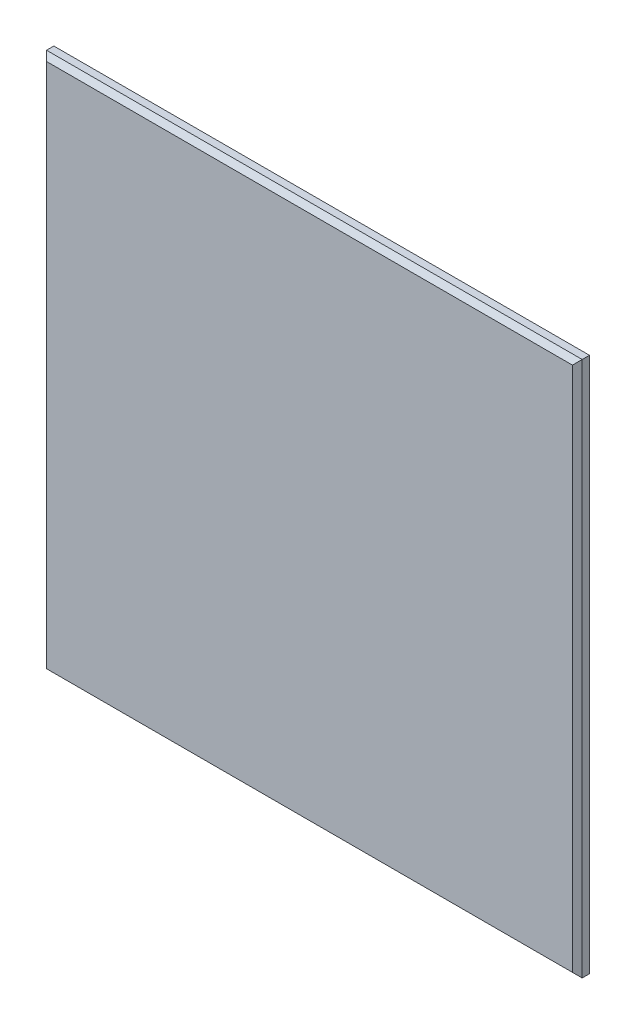
ISO-10303-21;
HEADER;
FILE_DESCRIPTION(('STEP AP214'),'2;1');
FILE_NAME('part.step','',(''),(''),'','','');
FILE_SCHEMA(('AUTOMOTIVE_DESIGN { 1 0 10303 214 1 1 1 1 }'));
ENDSEC;
DATA;
#1=APPLICATION_CONTEXT('core data for automotive mechanical design processes');
#2=APPLICATION_PROTOCOL_DEFINITION('international standard','automotive_design',2000,#1);
#3=PRODUCT_CONTEXT('',#1,'mechanical');
#4=PRODUCT('Part','Part','',(#3));
#5=PRODUCT_RELATED_PRODUCT_CATEGORY('part','',(#4));
#6=PRODUCT_DEFINITION_FORMATION('','',#4);
#7=PRODUCT_DEFINITION_CONTEXT('part definition',#1,'design');
#8=PRODUCT_DEFINITION('design','',#6,#7);
#9=PRODUCT_DEFINITION_SHAPE('','',#8);
#10=(LENGTH_UNIT() NAMED_UNIT(*) SI_UNIT(.MILLI.,.METRE.));
#11=(NAMED_UNIT(*) PLANE_ANGLE_UNIT() SI_UNIT($,.RADIAN.));
#12=(NAMED_UNIT(*) SI_UNIT($,.STERADIAN.) SOLID_ANGLE_UNIT());
#13=UNCERTAINTY_MEASURE_WITH_UNIT(LENGTH_MEASURE(1.E-05),#10,'distance_accuracy_value','');
#14=(GEOMETRIC_REPRESENTATION_CONTEXT(3) GLOBAL_UNCERTAINTY_ASSIGNED_CONTEXT((#13)) GLOBAL_UNIT_ASSIGNED_CONTEXT((#10,
#11,#12)) REPRESENTATION_CONTEXT('',''));
#15=CARTESIAN_POINT('',(0.,0.,0.));
#16=DIRECTION('',(0.,0.,1.));
#17=DIRECTION('',(1.,0.,0.));
#18=AXIS2_PLACEMENT_3D('',#15,#16,#17);
#19=CARTESIAN_POINT('',(110.,110.,5.));
#20=DIRECTION('',(-1.,0.,0.));
#21=DIRECTION('',(0.,0.,1.));
#22=AXIS2_PLACEMENT_3D('',#19,#20,#21);
#23=PLANE('',#22);
#24=DIRECTION('',(0.,0.,-1.));
#25=VECTOR('',#24,1.);
#26=CARTESIAN_POINT('',(110.,110.,5.));
#27=LINE('',#26,#25);
#28=CARTESIAN_POINT('',(110.,110.,2.99999999999997));
#29=VERTEX_POINT('',#28);
#30=CARTESIAN_POINT('',(110.,110.,0.));
#31=VERTEX_POINT('',#30);
#32=EDGE_CURVE('E85',#29,#31,#27,.T.);
#33=ORIENTED_EDGE('',*,*,#32,.F.);
#34=DIRECTION('',(0.,-1.,0.));
#35=VECTOR('',#34,1.);
#36=CARTESIAN_POINT('',(110.,-110.,2.99999999999997));
#37=LINE('',#36,#35);
#38=CARTESIAN_POINT('',(110.,-110.,2.99999999999997));
#39=VERTEX_POINT('',#38);
#40=EDGE_CURVE('E11',#29,#39,#37,.T.);
#41=ORIENTED_EDGE('',*,*,#40,.T.);
#42=DIRECTION('',(0.,0.,-1.));
#43=VECTOR('',#42,1.);
#44=CARTESIAN_POINT('',(110.,-110.,5.));
#45=LINE('',#44,#43);
#46=CARTESIAN_POINT('',(110.,-110.,0.));
#47=VERTEX_POINT('',#46);
#48=EDGE_CURVE('E105',#39,#47,#45,.T.);
#49=ORIENTED_EDGE('',*,*,#48,.T.);
#50=DIRECTION('',(0.,1.,0.));
#51=VECTOR('',#50,1.);
#52=CARTESIAN_POINT('',(110.,110.,0.));
#53=LINE('',#52,#51);
#54=EDGE_CURVE('E101',#47,#31,#53,.T.);
#55=ORIENTED_EDGE('',*,*,#54,.T.);
#56=EDGE_LOOP('',(#33,#41,#49,#55));
#57=FACE_BOUND('',#56,.T.);
#58=ADVANCED_FACE('F32',(#57),#23,.F.);
#59=CARTESIAN_POINT('',(-110.,110.,5.));
#60=DIRECTION('',(0.,-1.,0.));
#61=DIRECTION('',(0.,0.,-1.));
#62=AXIS2_PLACEMENT_3D('',#59,#60,#61);
#63=PLANE('',#62);
#64=DIRECTION('',(0.,0.,-1.));
#65=VECTOR('',#64,1.);
#66=CARTESIAN_POINT('',(-110.,110.,5.));
#67=LINE('',#66,#65);
#68=CARTESIAN_POINT('',(-110.,110.,2.99999999999997));
#69=VERTEX_POINT('',#68);
#70=CARTESIAN_POINT('',(-110.,110.,0.));
#71=VERTEX_POINT('',#70);
#72=EDGE_CURVE('E95',#69,#71,#67,.T.);
#73=ORIENTED_EDGE('',*,*,#72,.F.);
#74=DIRECTION('',(1.,0.,0.));
#75=VECTOR('',#74,1.);
#76=CARTESIAN_POINT('',(110.,110.,2.99999999999997));
#77=LINE('',#76,#75);
#78=EDGE_CURVE('E92',#69,#29,#77,.T.);
#79=ORIENTED_EDGE('',*,*,#78,.T.);
#80=ORIENTED_EDGE('',*,*,#32,.T.);
#81=DIRECTION('',(-1.,0.,0.));
#82=VECTOR('',#81,1.);
#83=CARTESIAN_POINT('',(-110.,110.,0.));
#84=LINE('',#83,#82);
#85=EDGE_CURVE('E89',#31,#71,#84,.T.);
#86=ORIENTED_EDGE('',*,*,#85,.T.);
#87=EDGE_LOOP('',(#73,#79,#80,#86));
#88=FACE_BOUND('',#87,.T.);
#89=ADVANCED_FACE('F88',(#88),#63,.F.);
#90=CARTESIAN_POINT('',(-110.,110.,5.));
#91=DIRECTION('',(1.,0.,0.));
#92=DIRECTION('',(0.,0.,-1.));
#93=AXIS2_PLACEMENT_3D('',#90,#91,#92);
#94=PLANE('',#93);
#95=DIRECTION('',(0.,0.,-1.));
#96=VECTOR('',#95,1.);
#97=CARTESIAN_POINT('',(-110.,-110.,5.));
#98=LINE('',#97,#96);
#99=CARTESIAN_POINT('',(-110.,-110.,2.99999999999997));
#100=VERTEX_POINT('',#99);
#101=CARTESIAN_POINT('',(-110.,-110.,0.));
#102=VERTEX_POINT('',#101);
#103=EDGE_CURVE('E115',#100,#102,#98,.T.);
#104=ORIENTED_EDGE('',*,*,#103,.F.);
#105=DIRECTION('',(0.,1.,0.));
#106=VECTOR('',#105,1.);
#107=CARTESIAN_POINT('',(-110.,110.,2.99999999999997));
#108=LINE('',#107,#106);
#109=EDGE_CURVE('E127',#100,#69,#108,.T.);
#110=ORIENTED_EDGE('',*,*,#109,.T.);
#111=ORIENTED_EDGE('',*,*,#72,.T.);
#112=DIRECTION('',(0.,-1.,0.));
#113=VECTOR('',#112,1.);
#114=CARTESIAN_POINT('',(-110.,110.,0.));
#115=LINE('',#114,#113);
#116=EDGE_CURVE('E103',#71,#102,#115,.T.);
#117=ORIENTED_EDGE('',*,*,#116,.T.);
#118=EDGE_LOOP('',(#104,#110,#111,#117));
#119=FACE_BOUND('',#118,.T.);
#120=ADVANCED_FACE('F163',(#119),#94,.F.);
#121=CARTESIAN_POINT('',(-110.,-110.,5.));
#122=DIRECTION('',(0.,1.,0.));
#123=DIRECTION('',(0.,0.,1.));
#124=AXIS2_PLACEMENT_3D('',#121,#122,#123);
#125=PLANE('',#124);
#126=ORIENTED_EDGE('',*,*,#48,.F.);
#127=DIRECTION('',(-1.,0.,0.));
#128=VECTOR('',#127,1.);
#129=CARTESIAN_POINT('',(-110.,-110.,2.99999999999997));
#130=LINE('',#129,#128);
#131=EDGE_CURVE('E41',#39,#100,#130,.T.);
#132=ORIENTED_EDGE('',*,*,#131,.T.);
#133=ORIENTED_EDGE('',*,*,#103,.T.);
#134=DIRECTION('',(1.,0.,0.));
#135=VECTOR('',#134,1.);
#136=CARTESIAN_POINT('',(-110.,-110.,0.));
#137=LINE('',#136,#135);
#138=EDGE_CURVE('E112',#102,#47,#137,.T.);
#139=ORIENTED_EDGE('',*,*,#138,.T.);
#140=EDGE_LOOP('',(#126,#132,#133,#139));
#141=FACE_BOUND('',#140,.T.);
#142=ADVANCED_FACE('F195',(#141),#125,.F.);
#143=CARTESIAN_POINT('',(0.,0.,5.));
#144=DIRECTION('',(0.,0.,1.));
#145=DIRECTION('',(1.,0.,0.));
#146=AXIS2_PLACEMENT_3D('',#143,#144,#145);
#147=PLANE('',#146);
#148=DIRECTION('',(0.,1.,0.));
#149=VECTOR('',#148,1.);
#150=CARTESIAN_POINT('',(108.,110.,5.));
#151=LINE('',#150,#149);
#152=CARTESIAN_POINT('',(108.,-108.,5.));
#153=VERTEX_POINT('',#152);
#154=CARTESIAN_POINT('',(108.,108.,5.));
#155=VERTEX_POINT('',#154);
#156=EDGE_CURVE('E94',#153,#155,#151,.T.);
#157=ORIENTED_EDGE('',*,*,#156,.T.);
#158=DIRECTION('',(-1.,0.,0.));
#159=VECTOR('',#158,1.);
#160=CARTESIAN_POINT('',(-110.,108.,5.));
#161=LINE('',#160,#159);
#162=CARTESIAN_POINT('',(-108.,108.,5.));
#163=VERTEX_POINT('',#162);
#164=EDGE_CURVE('E123',#155,#163,#161,.T.);
#165=ORIENTED_EDGE('',*,*,#164,.T.);
#166=DIRECTION('',(0.,-1.,0.));
#167=VECTOR('',#166,1.);
#168=CARTESIAN_POINT('',(-108.,-110.,5.));
#169=LINE('',#168,#167);
#170=CARTESIAN_POINT('',(-108.,-108.,5.));
#171=VERTEX_POINT('',#170);
#172=EDGE_CURVE('E121',#163,#171,#169,.T.);
#173=ORIENTED_EDGE('',*,*,#172,.T.);
#174=DIRECTION('',(1.,0.,0.));
#175=VECTOR('',#174,1.);
#176=CARTESIAN_POINT('',(110.,-108.,5.));
#177=LINE('',#176,#175);
#178=EDGE_CURVE('E119',#171,#153,#177,.T.);
#179=ORIENTED_EDGE('',*,*,#178,.T.);
#180=EDGE_LOOP('',(#157,#165,#173,#179));
#181=FACE_BOUND('',#180,.T.);
#182=ADVANCED_FACE('F145',(#181),#147,.T.);
#183=CARTESIAN_POINT('',(0.,0.,0.));
#184=DIRECTION('',(0.,0.,1.));
#185=DIRECTION('',(1.,0.,0.));
#186=AXIS2_PLACEMENT_3D('',#183,#184,#185);
#187=PLANE('',#186);
#188=ORIENTED_EDGE('',*,*,#54,.F.);
#189=ORIENTED_EDGE('',*,*,#138,.F.);
#190=ORIENTED_EDGE('',*,*,#116,.F.);
#191=ORIENTED_EDGE('',*,*,#85,.F.);
#192=EDGE_LOOP('',(#188,#189,#190,#191));
#193=FACE_BOUND('',#192,.T.);
#194=ADVANCED_FACE('F99',(#193),#187,.F.);
#195=CARTESIAN_POINT('',(0.,-108.,5.));
#196=DIRECTION('',(0.,-0.707106781186552,0.707106781186542));
#197=DIRECTION('',(-1.,0.,0.));
#198=AXIS2_PLACEMENT_3D('',#195,#196,#197);
#199=PLANE('',#198);
#200=DIRECTION('',(-0.577350269189623,-0.577350269189623,-0.577350269189631));
#201=VECTOR('',#200,1.);
#202=CARTESIAN_POINT('',(-72.0000000000003,-72.0000000000004,41.0000000000002));
#203=LINE('',#202,#201);
#204=EDGE_CURVE('E109',#100,#171,#203,.F.);
#205=ORIENTED_EDGE('',*,*,#204,.F.);
#206=ORIENTED_EDGE('',*,*,#131,.F.);
#207=DIRECTION('',(0.577350269189623,-0.577350269189623,-0.577350269189631));
#208=VECTOR('',#207,1.);
#209=CARTESIAN_POINT('',(72.0000000000003,-72.0000000000004,41.0000000000002));
#210=LINE('',#209,#208);
#211=EDGE_CURVE('E36',#153,#39,#210,.T.);
#212=ORIENTED_EDGE('',*,*,#211,.F.);
#213=ORIENTED_EDGE('',*,*,#178,.F.);
#214=EDGE_LOOP('',(#205,#206,#212,#213));
#215=FACE_BOUND('',#214,.T.);
#216=ADVANCED_FACE('F34',(#215),#199,.T.);
#217=CARTESIAN_POINT('',(108.,0.,5.));
#218=DIRECTION('',(0.707106781186552,0.,0.707106781186542));
#219=DIRECTION('',(0.,-1.,0.));
#220=AXIS2_PLACEMENT_3D('',#217,#218,#219);
#221=PLANE('',#220);
#222=ORIENTED_EDGE('',*,*,#211,.T.);
#223=ORIENTED_EDGE('',*,*,#40,.F.);
#224=DIRECTION('',(-0.577350269189623,-0.577350269189623,0.577350269189631));
#225=VECTOR('',#224,1.);
#226=CARTESIAN_POINT('',(72.0000000000003,72.0000000000004,41.0000000000002));
#227=LINE('',#226,#225);
#228=EDGE_CURVE('E132',#155,#29,#227,.F.);
#229=ORIENTED_EDGE('',*,*,#228,.F.);
#230=ORIENTED_EDGE('',*,*,#156,.F.);
#231=EDGE_LOOP('',(#222,#223,#229,#230));
#232=FACE_BOUND('',#231,.T.);
#233=ADVANCED_FACE('F151',(#232),#221,.T.);
#234=CARTESIAN_POINT('',(-108.,0.,5.));
#235=DIRECTION('',(-0.707106781186552,0.,0.707106781186542));
#236=DIRECTION('',(0.,1.,0.));
#237=AXIS2_PLACEMENT_3D('',#234,#235,#236);
#238=PLANE('',#237);
#239=ORIENTED_EDGE('',*,*,#204,.T.);
#240=ORIENTED_EDGE('',*,*,#172,.F.);
#241=DIRECTION('',(-0.577350269189623,0.577350269189623,-0.577350269189631));
#242=VECTOR('',#241,1.);
#243=CARTESIAN_POINT('',(-72.0000000000003,72.0000000000004,41.0000000000002));
#244=LINE('',#243,#242);
#245=EDGE_CURVE('E130',#69,#163,#244,.F.);
#246=ORIENTED_EDGE('',*,*,#245,.F.);
#247=ORIENTED_EDGE('',*,*,#109,.F.);
#248=EDGE_LOOP('',(#239,#240,#246,#247));
#249=FACE_BOUND('',#248,.T.);
#250=ADVANCED_FACE('F138',(#249),#238,.T.);
#251=CARTESIAN_POINT('',(0.,108.,5.));
#252=DIRECTION('',(0.,0.707106781186552,0.707106781186542));
#253=DIRECTION('',(1.,0.,0.));
#254=AXIS2_PLACEMENT_3D('',#251,#252,#253);
#255=PLANE('',#254);
#256=ORIENTED_EDGE('',*,*,#228,.T.);
#257=ORIENTED_EDGE('',*,*,#78,.F.);
#258=ORIENTED_EDGE('',*,*,#245,.T.);
#259=ORIENTED_EDGE('',*,*,#164,.F.);
#260=EDGE_LOOP('',(#256,#257,#258,#259));
#261=FACE_BOUND('',#260,.T.);
#262=ADVANCED_FACE('F149',(#261),#255,.T.);
#263=CLOSED_SHELL('',(#58,#89,#120,#142,#182,#194,#216,#233,#250,#262));
#264=MANIFOLD_SOLID_BREP('B2',#263);
#265=ADVANCED_BREP_SHAPE_REPRESENTATION('',(#18,#264),#14);
#266=SHAPE_DEFINITION_REPRESENTATION(#9,#265);
ENDSEC;
END-ISO-10303-21;
